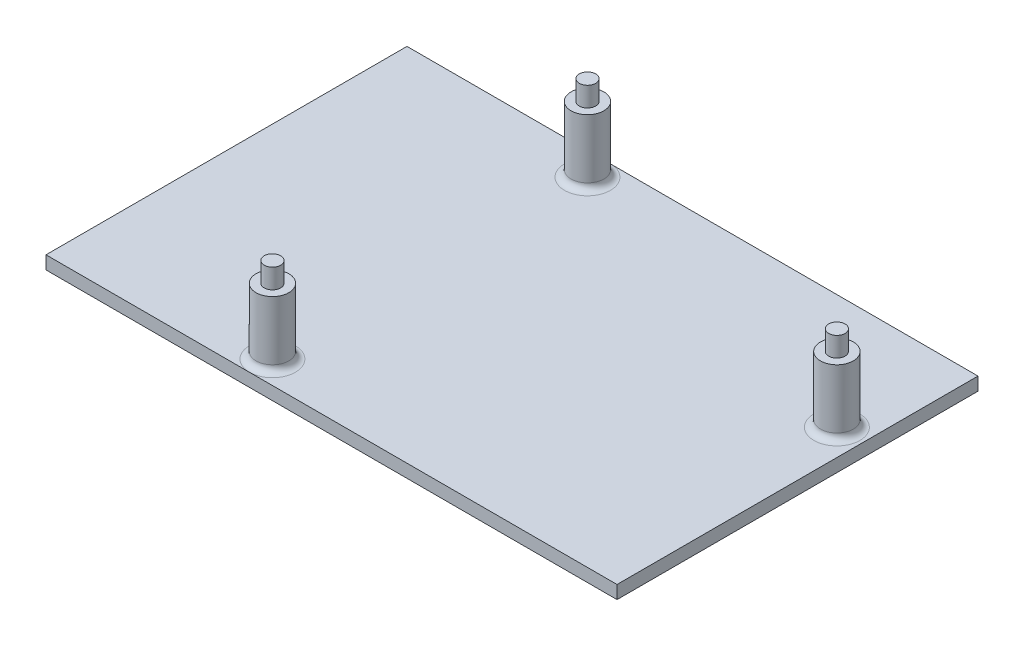
ISO-10303-21;
HEADER;
FILE_DESCRIPTION(('STEP AP214'),'2;1');
FILE_NAME('part.step','',(''),(''),'','','');
FILE_SCHEMA(('AUTOMOTIVE_DESIGN { 1 0 10303 214 1 1 1 1 }'));
ENDSEC;
DATA;
#1=APPLICATION_CONTEXT('core data for automotive mechanical design processes');
#2=APPLICATION_PROTOCOL_DEFINITION('international standard','automotive_design',2000,#1);
#3=PRODUCT_CONTEXT('',#1,'mechanical');
#4=PRODUCT('Part','Part','',(#3));
#5=PRODUCT_RELATED_PRODUCT_CATEGORY('part','',(#4));
#6=PRODUCT_DEFINITION_FORMATION('','',#4);
#7=PRODUCT_DEFINITION_CONTEXT('part definition',#1,'design');
#8=PRODUCT_DEFINITION('design','',#6,#7);
#9=PRODUCT_DEFINITION_SHAPE('','',#8);
#10=(LENGTH_UNIT() NAMED_UNIT(*) SI_UNIT(.MILLI.,.METRE.));
#11=(NAMED_UNIT(*) PLANE_ANGLE_UNIT() SI_UNIT($,.RADIAN.));
#12=(NAMED_UNIT(*) SI_UNIT($,.STERADIAN.) SOLID_ANGLE_UNIT());
#13=UNCERTAINTY_MEASURE_WITH_UNIT(LENGTH_MEASURE(1.E-05),#10,'distance_accuracy_value','');
#14=(GEOMETRIC_REPRESENTATION_CONTEXT(3) GLOBAL_UNCERTAINTY_ASSIGNED_CONTEXT((#13)) GLOBAL_UNIT_ASSIGNED_CONTEXT((#10,
#11,#12)) REPRESENTATION_CONTEXT('',''));
#15=CARTESIAN_POINT('',(0.,0.,0.));
#16=DIRECTION('',(0.,0.,1.));
#17=DIRECTION('',(1.,0.,0.));
#18=AXIS2_PLACEMENT_3D('',#15,#16,#17);
#19=CARTESIAN_POINT('',(0.,2.,0.));
#20=DIRECTION('',(1.,0.,0.));
#21=DIRECTION('',(0.,0.,-1.));
#22=AXIS2_PLACEMENT_3D('',#19,#20,#21);
#23=PLANE('',#22);
#24=DIRECTION('',(0.,0.,1.));
#25=VECTOR('',#24,1.);
#26=CARTESIAN_POINT('',(0.,0.,0.));
#27=LINE('',#26,#25);
#28=CARTESIAN_POINT('',(0.,0.,-55.));
#29=VERTEX_POINT('',#28);
#30=CARTESIAN_POINT('',(0.,0.,0.));
#31=VERTEX_POINT('',#30);
#32=EDGE_CURVE('E107',#29,#31,#27,.T.);
#33=ORIENTED_EDGE('',*,*,#32,.T.);
#34=DIRECTION('',(0.,-1.,0.));
#35=VECTOR('',#34,1.);
#36=CARTESIAN_POINT('',(0.,2.,0.));
#37=LINE('',#36,#35);
#38=CARTESIAN_POINT('',(0.,2.,0.));
#39=VERTEX_POINT('',#38);
#40=EDGE_CURVE('E89',#39,#31,#37,.T.);
#41=ORIENTED_EDGE('',*,*,#40,.F.);
#42=DIRECTION('',(0.,0.,1.));
#43=VECTOR('',#42,1.);
#44=CARTESIAN_POINT('',(0.,2.,0.));
#45=LINE('',#44,#43);
#46=CARTESIAN_POINT('',(0.,2.,-55.));
#47=VERTEX_POINT('',#46);
#48=EDGE_CURVE('E97',#47,#39,#45,.T.);
#49=ORIENTED_EDGE('',*,*,#48,.F.);
#50=DIRECTION('',(0.,-1.,0.));
#51=VECTOR('',#50,1.);
#52=CARTESIAN_POINT('',(0.,2.,-55.));
#53=LINE('',#52,#51);
#54=EDGE_CURVE('E239',#47,#29,#53,.T.);
#55=ORIENTED_EDGE('',*,*,#54,.T.);
#56=EDGE_LOOP('',(#33,#41,#49,#55));
#57=FACE_BOUND('',#56,.T.);
#58=ADVANCED_FACE('F39',(#57),#23,.F.);
#59=CARTESIAN_POINT('',(0.,2.,0.));
#60=DIRECTION('',(0.,0.,-1.));
#61=DIRECTION('',(-1.,0.,0.));
#62=AXIS2_PLACEMENT_3D('',#59,#60,#61);
#63=PLANE('',#62);
#64=DIRECTION('',(1.,0.,0.));
#65=VECTOR('',#64,1.);
#66=CARTESIAN_POINT('',(0.,0.,0.));
#67=LINE('',#66,#65);
#68=CARTESIAN_POINT('',(87.,0.,0.));
#69=VERTEX_POINT('',#68);
#70=EDGE_CURVE('E241',#31,#69,#67,.T.);
#71=ORIENTED_EDGE('',*,*,#70,.T.);
#72=DIRECTION('',(0.,-1.,0.));
#73=VECTOR('',#72,1.);
#74=CARTESIAN_POINT('',(87.,2.,0.));
#75=LINE('',#74,#73);
#76=CARTESIAN_POINT('',(87.,2.,0.));
#77=VERTEX_POINT('',#76);
#78=EDGE_CURVE('E109',#77,#69,#75,.T.);
#79=ORIENTED_EDGE('',*,*,#78,.F.);
#80=DIRECTION('',(1.,0.,0.));
#81=VECTOR('',#80,1.);
#82=CARTESIAN_POINT('',(0.,2.,0.));
#83=LINE('',#82,#81);
#84=CARTESIAN_POINT('',(31.,2.,0.));
#85=VERTEX_POINT('',#84);
#86=EDGE_CURVE('E92',#85,#77,#83,.T.);
#87=ORIENTED_EDGE('',*,*,#86,.F.);
#88=EDGE_CURVE('E85',#39,#85,#83,.T.);
#89=ORIENTED_EDGE('',*,*,#88,.F.);
#90=ORIENTED_EDGE('',*,*,#40,.T.);
#91=EDGE_LOOP('',(#71,#79,#87,#89,#90));
#92=FACE_BOUND('',#91,.T.);
#93=ADVANCED_FACE('F87',(#92),#63,.F.);
#94=CARTESIAN_POINT('',(87.,2.,0.));
#95=DIRECTION('',(-1.,0.,0.));
#96=DIRECTION('',(0.,0.,1.));
#97=AXIS2_PLACEMENT_3D('',#94,#95,#96);
#98=PLANE('',#97);
#99=DIRECTION('',(0.,0.,-1.));
#100=VECTOR('',#99,1.);
#101=CARTESIAN_POINT('',(87.,0.,0.));
#102=LINE('',#101,#100);
#103=CARTESIAN_POINT('',(87.,0.,-55.));
#104=VERTEX_POINT('',#103);
#105=EDGE_CURVE('E243',#69,#104,#102,.T.);
#106=ORIENTED_EDGE('',*,*,#105,.T.);
#107=DIRECTION('',(0.,-1.,0.));
#108=VECTOR('',#107,1.);
#109=CARTESIAN_POINT('',(87.,2.,-55.));
#110=LINE('',#109,#108);
#111=CARTESIAN_POINT('',(87.,2.,-55.));
#112=VERTEX_POINT('',#111);
#113=EDGE_CURVE('E115',#112,#104,#110,.T.);
#114=ORIENTED_EDGE('',*,*,#113,.F.);
#115=DIRECTION('',(0.,0.,-1.));
#116=VECTOR('',#115,1.);
#117=CARTESIAN_POINT('',(87.,2.,0.));
#118=LINE('',#117,#116);
#119=EDGE_CURVE('E94',#77,#112,#118,.T.);
#120=ORIENTED_EDGE('',*,*,#119,.F.);
#121=ORIENTED_EDGE('',*,*,#78,.T.);
#122=EDGE_LOOP('',(#106,#114,#120,#121));
#123=FACE_BOUND('',#122,.T.);
#124=ADVANCED_FACE('F149',(#123),#98,.F.);
#125=CARTESIAN_POINT('',(0.,2.,-55.));
#126=DIRECTION('',(0.,0.,1.));
#127=DIRECTION('',(1.,0.,0.));
#128=AXIS2_PLACEMENT_3D('',#125,#126,#127);
#129=PLANE('',#128);
#130=DIRECTION('',(-1.,0.,0.));
#131=VECTOR('',#130,1.);
#132=CARTESIAN_POINT('',(0.,0.,-55.));
#133=LINE('',#132,#131);
#134=EDGE_CURVE('E104',#104,#29,#133,.T.);
#135=ORIENTED_EDGE('',*,*,#134,.T.);
#136=ORIENTED_EDGE('',*,*,#54,.F.);
#137=DIRECTION('',(-1.,0.,0.));
#138=VECTOR('',#137,1.);
#139=CARTESIAN_POINT('',(0.,2.,-55.));
#140=LINE('',#139,#138);
#141=CARTESIAN_POINT('',(31.,2.,-55.));
#142=VERTEX_POINT('',#141);
#143=EDGE_CURVE('E100',#142,#47,#140,.T.);
#144=ORIENTED_EDGE('',*,*,#143,.F.);
#145=EDGE_CURVE('E236',#112,#142,#140,.T.);
#146=ORIENTED_EDGE('',*,*,#145,.F.);
#147=ORIENTED_EDGE('',*,*,#113,.T.);
#148=EDGE_LOOP('',(#135,#136,#144,#146,#147));
#149=FACE_BOUND('',#148,.T.);
#150=ADVANCED_FACE('F153',(#149),#129,.F.);
#151=CARTESIAN_POINT('',(0.,2.,0.));
#152=DIRECTION('',(0.,-1.,0.));
#153=DIRECTION('',(0.,0.,-1.));
#154=AXIS2_PLACEMENT_3D('',#151,#152,#153);
#155=PLANE('',#154);
#156=CARTESIAN_POINT('',(83.,2.,-37.5));
#157=DIRECTION('',(0.,-1.,0.));
#158=DIRECTION('',(0.,0.,-1.));
#159=AXIS2_PLACEMENT_3D('',#156,#157,#158);
#160=CIRCLE('',#159,3.50000000000001);
#161=CARTESIAN_POINT('',(83.,2.,-41.));
#162=VERTEX_POINT('',#161);
#163=EDGE_CURVE('E125',#162,#162,#160,.T.);
#164=ORIENTED_EDGE('',*,*,#163,.T.);
#165=EDGE_LOOP('',(#164));
#166=FACE_BOUND('',#165,.T.);
#167=ORIENTED_EDGE('',*,*,#88,.T.);
#168=CARTESIAN_POINT('',(31.,2.,-3.49999999999999));
#169=DIRECTION('',(0.,-1.,0.));
#170=DIRECTION('',(0.,0.,-1.));
#171=AXIS2_PLACEMENT_3D('',#168,#169,#170);
#172=CIRCLE('',#171,3.49999999999999);
#173=EDGE_CURVE('E57',#85,#85,#172,.T.);
#174=ORIENTED_EDGE('',*,*,#173,.T.);
#175=ORIENTED_EDGE('',*,*,#86,.T.);
#176=ORIENTED_EDGE('',*,*,#119,.T.);
#177=ORIENTED_EDGE('',*,*,#145,.T.);
#178=CARTESIAN_POINT('',(31.,2.,-51.5));
#179=DIRECTION('',(0.,-1.,0.));
#180=DIRECTION('',(0.,0.,-1.));
#181=AXIS2_PLACEMENT_3D('',#178,#179,#180);
#182=CIRCLE('',#181,3.5);
#183=EDGE_CURVE('E52',#142,#142,#182,.T.);
#184=ORIENTED_EDGE('',*,*,#183,.T.);
#185=ORIENTED_EDGE('',*,*,#143,.T.);
#186=ORIENTED_EDGE('',*,*,#48,.T.);
#187=EDGE_LOOP('',(#167,#174,#175,#176,#177,#184,#185,#186));
#188=FACE_BOUND('',#187,.T.);
#189=ADVANCED_FACE('F98',(#166,#188),#155,.F.);
#190=CARTESIAN_POINT('',(0.,0.,0.));
#191=DIRECTION('',(0.,-1.,0.));
#192=DIRECTION('',(0.,0.,-1.));
#193=AXIS2_PLACEMENT_3D('',#190,#191,#192);
#194=PLANE('',#193);
#195=ORIENTED_EDGE('',*,*,#32,.F.);
#196=ORIENTED_EDGE('',*,*,#134,.F.);
#197=ORIENTED_EDGE('',*,*,#105,.F.);
#198=ORIENTED_EDGE('',*,*,#70,.F.);
#199=EDGE_LOOP('',(#195,#196,#197,#198));
#200=FACE_BOUND('',#199,.T.);
#201=ADVANCED_FACE('F158',(#200),#194,.T.);
#202=CARTESIAN_POINT('',(83.,12.,-37.5));
#203=DIRECTION('',(0.,-1.,0.));
#204=DIRECTION('',(0.,0.,-1.));
#205=AXIS2_PLACEMENT_3D('',#202,#203,#204);
#206=CYLINDRICAL_SURFACE('',#205,2.50000000000001);
#207=CARTESIAN_POINT('',(83.,3.,-37.5));
#208=DIRECTION('',(0.,-1.,0.));
#209=DIRECTION('',(0.,0.,-1.));
#210=AXIS2_PLACEMENT_3D('',#207,#208,#209);
#211=CIRCLE('',#210,2.50000000000001);
#212=CARTESIAN_POINT('',(83.,3.,-40.));
#213=VERTEX_POINT('',#212);
#214=EDGE_CURVE('E119',#213,#213,#211,.F.);
#215=ORIENTED_EDGE('',*,*,#214,.T.);
#216=EDGE_LOOP('',(#215));
#217=FACE_BOUND('',#216,.T.);
#218=CARTESIAN_POINT('',(83.,12.,-37.5));
#219=DIRECTION('',(0.,1.,0.));
#220=DIRECTION('',(0.,0.,1.));
#221=AXIS2_PLACEMENT_3D('',#218,#219,#220);
#222=CIRCLE('',#221,2.50000000000001);
#223=CARTESIAN_POINT('',(83.,12.,-35.));
#224=VERTEX_POINT('',#223);
#225=EDGE_CURVE('E214',#224,#224,#222,.T.);
#226=ORIENTED_EDGE('',*,*,#225,.F.);
#227=EDGE_LOOP('',(#226));
#228=FACE_BOUND('',#227,.T.);
#229=ADVANCED_FACE('F161',(#217,#228),#206,.T.);
#230=CARTESIAN_POINT('',(83.,12.,-37.5));
#231=DIRECTION('',(0.,1.,0.));
#232=DIRECTION('',(0.,0.,1.));
#233=AXIS2_PLACEMENT_3D('',#230,#231,#232);
#234=PLANE('',#233);
#235=CARTESIAN_POINT('',(83.,12.,-37.5));
#236=DIRECTION('',(0.,1.,0.));
#237=DIRECTION('',(0.,0.,1.));
#238=AXIS2_PLACEMENT_3D('',#235,#236,#237);
#239=CIRCLE('',#238,1.25);
#240=CARTESIAN_POINT('',(83.,12.,-36.25));
#241=VERTEX_POINT('',#240);
#242=EDGE_CURVE('E122',#241,#241,#239,.T.);
#243=ORIENTED_EDGE('',*,*,#242,.F.);
#244=EDGE_LOOP('',(#243));
#245=FACE_BOUND('',#244,.T.);
#246=ORIENTED_EDGE('',*,*,#225,.T.);
#247=EDGE_LOOP('',(#246));
#248=FACE_BOUND('',#247,.T.);
#249=ADVANCED_FACE('F166',(#245,#248),#234,.T.);
#250=CARTESIAN_POINT('',(31.,12.,-3.49999999999999));
#251=DIRECTION('',(0.,-1.,0.));
#252=DIRECTION('',(0.,0.,-1.));
#253=AXIS2_PLACEMENT_3D('',#250,#251,#252);
#254=CYLINDRICAL_SURFACE('',#253,2.49999999999999);
#255=CARTESIAN_POINT('',(31.,3.,-3.49999999999999));
#256=DIRECTION('',(0.,-1.,0.));
#257=DIRECTION('',(0.,0.,-1.));
#258=AXIS2_PLACEMENT_3D('',#255,#256,#257);
#259=CIRCLE('',#258,2.49999999999999);
#260=CARTESIAN_POINT('',(31.,3.,-5.99999999999999));
#261=VERTEX_POINT('',#260);
#262=EDGE_CURVE('E47',#261,#261,#259,.F.);
#263=ORIENTED_EDGE('',*,*,#262,.T.);
#264=EDGE_LOOP('',(#263));
#265=FACE_BOUND('',#264,.T.);
#266=CARTESIAN_POINT('',(31.,12.,-3.49999999999999));
#267=DIRECTION('',(0.,1.,0.));
#268=DIRECTION('',(0.,0.,1.));
#269=AXIS2_PLACEMENT_3D('',#266,#267,#268);
#270=CIRCLE('',#269,2.49999999999999);
#271=CARTESIAN_POINT('',(31.,12.,-0.999999999999998));
#272=VERTEX_POINT('',#271);
#273=EDGE_CURVE('E218',#272,#272,#270,.T.);
#274=ORIENTED_EDGE('',*,*,#273,.F.);
#275=EDGE_LOOP('',(#274));
#276=FACE_BOUND('',#275,.T.);
#277=ADVANCED_FACE('F130',(#265,#276),#254,.T.);
#278=CARTESIAN_POINT('',(31.,12.,-3.49999999999999));
#279=DIRECTION('',(0.,1.,0.));
#280=DIRECTION('',(0.,0.,1.));
#281=AXIS2_PLACEMENT_3D('',#278,#279,#280);
#282=PLANE('',#281);
#283=CARTESIAN_POINT('',(31.,12.,-3.49999999999999));
#284=DIRECTION('',(0.,1.,0.));
#285=DIRECTION('',(0.,0.,1.));
#286=AXIS2_PLACEMENT_3D('',#283,#284,#285);
#287=CIRCLE('',#286,1.25);
#288=CARTESIAN_POINT('',(31.,12.,-2.24999999999999));
#289=VERTEX_POINT('',#288);
#290=EDGE_CURVE('E112',#289,#289,#287,.T.);
#291=ORIENTED_EDGE('',*,*,#290,.F.);
#292=EDGE_LOOP('',(#291));
#293=FACE_BOUND('',#292,.T.);
#294=ORIENTED_EDGE('',*,*,#273,.T.);
#295=EDGE_LOOP('',(#294));
#296=FACE_BOUND('',#295,.T.);
#297=ADVANCED_FACE('F173',(#293,#296),#282,.T.);
#298=CARTESIAN_POINT('',(31.,12.,-51.5));
#299=DIRECTION('',(0.,-1.,0.));
#300=DIRECTION('',(0.,0.,-1.));
#301=AXIS2_PLACEMENT_3D('',#298,#299,#300);
#302=CYLINDRICAL_SURFACE('',#301,2.5);
#303=CARTESIAN_POINT('',(31.,3.,-51.5));
#304=DIRECTION('',(0.,-1.,0.));
#305=DIRECTION('',(0.,0.,-1.));
#306=AXIS2_PLACEMENT_3D('',#303,#304,#305);
#307=CIRCLE('',#306,2.5);
#308=CARTESIAN_POINT('',(31.,3.,-54.));
#309=VERTEX_POINT('',#308);
#310=EDGE_CURVE('E11',#309,#309,#307,.F.);
#311=ORIENTED_EDGE('',*,*,#310,.T.);
#312=EDGE_LOOP('',(#311));
#313=FACE_BOUND('',#312,.T.);
#314=CARTESIAN_POINT('',(31.,12.,-51.5));
#315=DIRECTION('',(0.,1.,0.));
#316=DIRECTION('',(0.,0.,1.));
#317=AXIS2_PLACEMENT_3D('',#314,#315,#316);
#318=CIRCLE('',#317,2.5);
#319=CARTESIAN_POINT('',(31.,12.,-49.));
#320=VERTEX_POINT('',#319);
#321=EDGE_CURVE('E230',#320,#320,#318,.T.);
#322=ORIENTED_EDGE('',*,*,#321,.F.);
#323=EDGE_LOOP('',(#322));
#324=FACE_BOUND('',#323,.T.);
#325=ADVANCED_FACE('F176',(#313,#324),#302,.T.);
#326=CARTESIAN_POINT('',(31.,12.,-51.5));
#327=DIRECTION('',(0.,1.,0.));
#328=DIRECTION('',(0.,0.,1.));
#329=AXIS2_PLACEMENT_3D('',#326,#327,#328);
#330=PLANE('',#329);
#331=CARTESIAN_POINT('',(31.,12.,-51.5));
#332=DIRECTION('',(0.,1.,0.));
#333=DIRECTION('',(0.,0.,1.));
#334=AXIS2_PLACEMENT_3D('',#331,#332,#333);
#335=CIRCLE('',#334,1.25);
#336=CARTESIAN_POINT('',(31.,12.,-50.25));
#337=VERTEX_POINT('',#336);
#338=EDGE_CURVE('E108',#337,#337,#335,.T.);
#339=ORIENTED_EDGE('',*,*,#338,.F.);
#340=EDGE_LOOP('',(#339));
#341=FACE_BOUND('',#340,.T.);
#342=ORIENTED_EDGE('',*,*,#321,.T.);
#343=EDGE_LOOP('',(#342));
#344=FACE_BOUND('',#343,.T.);
#345=ADVANCED_FACE('F182',(#341,#344),#330,.T.);
#346=CARTESIAN_POINT('',(31.,15.,-51.5));
#347=DIRECTION('',(0.,-1.,0.));
#348=DIRECTION('',(0.,0.,-1.));
#349=AXIS2_PLACEMENT_3D('',#346,#347,#348);
#350=CYLINDRICAL_SURFACE('',#349,1.25);
#351=CARTESIAN_POINT('',(31.,15.,-51.5));
#352=DIRECTION('',(0.,1.,0.));
#353=DIRECTION('',(0.,0.,1.));
#354=AXIS2_PLACEMENT_3D('',#351,#352,#353);
#355=CIRCLE('',#354,1.25);
#356=CARTESIAN_POINT('',(31.,15.,-50.25));
#357=VERTEX_POINT('',#356);
#358=EDGE_CURVE('E213',#357,#357,#355,.T.);
#359=ORIENTED_EDGE('',*,*,#358,.F.);
#360=EDGE_LOOP('',(#359));
#361=FACE_BOUND('',#360,.T.);
#362=ORIENTED_EDGE('',*,*,#338,.T.);
#363=EDGE_LOOP('',(#362));
#364=FACE_BOUND('',#363,.T.);
#365=ADVANCED_FACE('F186',(#361,#364),#350,.T.);
#366=CARTESIAN_POINT('',(31.,15.,-51.5));
#367=DIRECTION('',(0.,1.,0.));
#368=DIRECTION('',(0.,0.,1.));
#369=AXIS2_PLACEMENT_3D('',#366,#367,#368);
#370=PLANE('',#369);
#371=ORIENTED_EDGE('',*,*,#358,.T.);
#372=EDGE_LOOP('',(#371));
#373=FACE_BOUND('',#372,.T.);
#374=ADVANCED_FACE('F202',(#373),#370,.T.);
#375=CARTESIAN_POINT('',(31.,15.,-3.49999999999999));
#376=DIRECTION('',(0.,-1.,0.));
#377=DIRECTION('',(0.,0.,-1.));
#378=AXIS2_PLACEMENT_3D('',#375,#376,#377);
#379=CYLINDRICAL_SURFACE('',#378,1.25);
#380=CARTESIAN_POINT('',(31.,15.,-3.49999999999999));
#381=DIRECTION('',(0.,1.,0.));
#382=DIRECTION('',(0.,0.,1.));
#383=AXIS2_PLACEMENT_3D('',#380,#381,#382);
#384=CIRCLE('',#383,1.25);
#385=CARTESIAN_POINT('',(31.,15.,-2.24999999999999));
#386=VERTEX_POINT('',#385);
#387=EDGE_CURVE('E215',#386,#386,#384,.T.);
#388=ORIENTED_EDGE('',*,*,#387,.F.);
#389=EDGE_LOOP('',(#388));
#390=FACE_BOUND('',#389,.T.);
#391=ORIENTED_EDGE('',*,*,#290,.T.);
#392=EDGE_LOOP('',(#391));
#393=FACE_BOUND('',#392,.T.);
#394=ADVANCED_FACE('F198',(#390,#393),#379,.T.);
#395=CARTESIAN_POINT('',(31.,15.,-3.49999999999999));
#396=DIRECTION('',(0.,1.,0.));
#397=DIRECTION('',(0.,0.,1.));
#398=AXIS2_PLACEMENT_3D('',#395,#396,#397);
#399=PLANE('',#398);
#400=ORIENTED_EDGE('',*,*,#387,.T.);
#401=EDGE_LOOP('',(#400));
#402=FACE_BOUND('',#401,.T.);
#403=ADVANCED_FACE('F194',(#402),#399,.T.);
#404=CARTESIAN_POINT('',(83.,15.,-37.5));
#405=DIRECTION('',(0.,-1.,0.));
#406=DIRECTION('',(0.,0.,-1.));
#407=AXIS2_PLACEMENT_3D('',#404,#405,#406);
#408=CYLINDRICAL_SURFACE('',#407,1.25);
#409=CARTESIAN_POINT('',(83.,15.,-37.5));
#410=DIRECTION('',(0.,1.,0.));
#411=DIRECTION('',(0.,0.,1.));
#412=AXIS2_PLACEMENT_3D('',#409,#410,#411);
#413=CIRCLE('',#412,1.25);
#414=CARTESIAN_POINT('',(83.,15.,-36.25));
#415=VERTEX_POINT('',#414);
#416=EDGE_CURVE('E221',#415,#415,#413,.T.);
#417=ORIENTED_EDGE('',*,*,#416,.F.);
#418=EDGE_LOOP('',(#417));
#419=FACE_BOUND('',#418,.T.);
#420=ORIENTED_EDGE('',*,*,#242,.T.);
#421=EDGE_LOOP('',(#420));
#422=FACE_BOUND('',#421,.T.);
#423=ADVANCED_FACE('F190',(#419,#422),#408,.T.);
#424=CARTESIAN_POINT('',(83.,15.,-37.5));
#425=DIRECTION('',(0.,1.,0.));
#426=DIRECTION('',(0.,0.,1.));
#427=AXIS2_PLACEMENT_3D('',#424,#425,#426);
#428=PLANE('',#427);
#429=ORIENTED_EDGE('',*,*,#416,.T.);
#430=EDGE_LOOP('',(#429));
#431=FACE_BOUND('',#430,.T.);
#432=ADVANCED_FACE('F140',(#431),#428,.T.);
#433=CARTESIAN_POINT('',(83.,3.,-37.5));
#434=DIRECTION('',(0.,-1.,0.));
#435=DIRECTION('',(0.,0.,-1.));
#436=AXIS2_PLACEMENT_3D('',#433,#434,#435);
#437=TOROIDAL_SURFACE('',#436,3.50000000000001,1.);
#438=ORIENTED_EDGE('',*,*,#163,.F.);
#439=EDGE_LOOP('',(#438));
#440=FACE_BOUND('',#439,.T.);
#441=ORIENTED_EDGE('',*,*,#214,.F.);
#442=EDGE_LOOP('',(#441));
#443=FACE_BOUND('',#442,.T.);
#444=ADVANCED_FACE('F135',(#440,#443),#437,.F.);
#445=CARTESIAN_POINT('',(31.,3.,-3.49999999999999));
#446=DIRECTION('',(0.,-1.,0.));
#447=DIRECTION('',(0.,0.,-1.));
#448=AXIS2_PLACEMENT_3D('',#445,#446,#447);
#449=TOROIDAL_SURFACE('',#448,3.49999999999999,1.);
#450=ORIENTED_EDGE('',*,*,#173,.F.);
#451=EDGE_LOOP('',(#450));
#452=FACE_BOUND('',#451,.T.);
#453=ORIENTED_EDGE('',*,*,#262,.F.);
#454=EDGE_LOOP('',(#453));
#455=FACE_BOUND('',#454,.T.);
#456=ADVANCED_FACE('F133',(#452,#455),#449,.F.);
#457=CARTESIAN_POINT('',(31.,3.,-51.5));
#458=DIRECTION('',(0.,-1.,0.));
#459=DIRECTION('',(0.,0.,-1.));
#460=AXIS2_PLACEMENT_3D('',#457,#458,#459);
#461=TOROIDAL_SURFACE('',#460,3.5,1.);
#462=ORIENTED_EDGE('',*,*,#183,.F.);
#463=EDGE_LOOP('',(#462));
#464=FACE_BOUND('',#463,.T.);
#465=ORIENTED_EDGE('',*,*,#310,.F.);
#466=EDGE_LOOP('',(#465));
#467=FACE_BOUND('',#466,.T.);
#468=ADVANCED_FACE('F41',(#464,#467),#461,.F.);
#469=CLOSED_SHELL('',(#58,#93,#124,#150,#189,#201,#229,#249,#277,#297,#325,#345,#365,#374,#394,
#403,#423,#432,#444,#456,#468));
#470=MANIFOLD_SOLID_BREP('B2',#469);
#471=ADVANCED_BREP_SHAPE_REPRESENTATION('',(#18,#470),#14);
#472=SHAPE_DEFINITION_REPRESENTATION(#9,#471);
ENDSEC;
END-ISO-10303-21;
